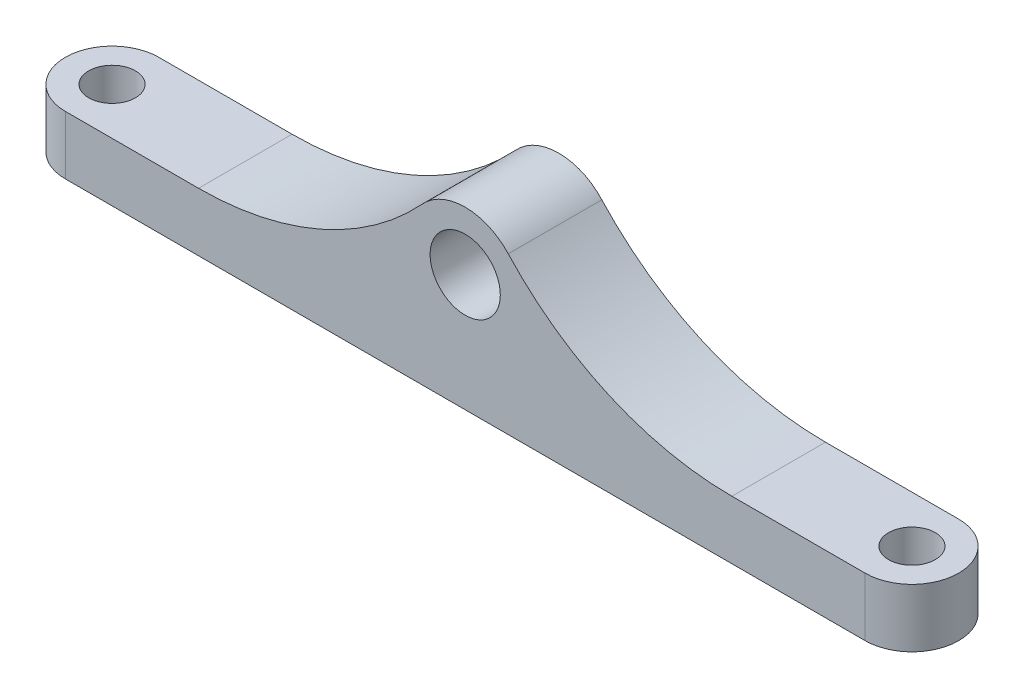
ISO-10303-21;
HEADER;
FILE_DESCRIPTION(('STEP AP214'),'2;1');
FILE_NAME('part.step','',(''),(''),'','','');
FILE_SCHEMA(('AUTOMOTIVE_DESIGN { 1 0 10303 214 1 1 1 1 }'));
ENDSEC;
DATA;
#1=APPLICATION_CONTEXT('core data for automotive mechanical design processes');
#2=APPLICATION_PROTOCOL_DEFINITION('international standard','automotive_design',2000,#1);
#3=PRODUCT_CONTEXT('',#1,'mechanical');
#4=PRODUCT('Part','Part','',(#3));
#5=PRODUCT_RELATED_PRODUCT_CATEGORY('part','',(#4));
#6=PRODUCT_DEFINITION_FORMATION('','',#4);
#7=PRODUCT_DEFINITION_CONTEXT('part definition',#1,'design');
#8=PRODUCT_DEFINITION('design','',#6,#7);
#9=PRODUCT_DEFINITION_SHAPE('','',#8);
#10=(LENGTH_UNIT() NAMED_UNIT(*) SI_UNIT(.MILLI.,.METRE.));
#11=(NAMED_UNIT(*) PLANE_ANGLE_UNIT() SI_UNIT($,.RADIAN.));
#12=(NAMED_UNIT(*) SI_UNIT($,.STERADIAN.) SOLID_ANGLE_UNIT());
#13=UNCERTAINTY_MEASURE_WITH_UNIT(LENGTH_MEASURE(1.E-05),#10,'distance_accuracy_value','');
#14=(GEOMETRIC_REPRESENTATION_CONTEXT(3) GLOBAL_UNCERTAINTY_ASSIGNED_CONTEXT((#13)) GLOBAL_UNIT_ASSIGNED_CONTEXT((#10,
#11,#12)) REPRESENTATION_CONTEXT('',''));
#15=CARTESIAN_POINT('',(0.,0.,0.));
#16=DIRECTION('',(0.,0.,1.));
#17=DIRECTION('',(1.,0.,0.));
#18=AXIS2_PLACEMENT_3D('',#15,#16,#17);
#19=CARTESIAN_POINT('',(0.,5.,0.));
#20=DIRECTION('',(0.,1.,0.));
#21=DIRECTION('',(0.,0.,1.));
#22=AXIS2_PLACEMENT_3D('',#19,#20,#21);
#23=PLANE('',#22);
#24=DIRECTION('',(0.,0.,1.));
#25=VECTOR('',#24,1.);
#26=CARTESIAN_POINT('',(-22.7988989435407,5.,-50.6814649743463));
#27=LINE('',#26,#25);
#28=CARTESIAN_POINT('',(-22.7988989435407,5.,-4.));
#29=VERTEX_POINT('',#28);
#30=CARTESIAN_POINT('',(-22.7988989435407,5.,4.));
#31=VERTEX_POINT('',#30);
#32=EDGE_CURVE('E154',#29,#31,#27,.T.);
#33=ORIENTED_EDGE('',*,*,#32,.F.);
#34=DIRECTION('',(1.,0.,0.));
#35=VECTOR('',#34,1.);
#36=CARTESIAN_POINT('',(0.,5.,-4.));
#37=LINE('',#36,#35);
#38=CARTESIAN_POINT('',(-34.19,5.,-4.));
#39=VERTEX_POINT('',#38);
#40=EDGE_CURVE('E138',#39,#29,#37,.T.);
#41=ORIENTED_EDGE('',*,*,#40,.F.);
#42=CARTESIAN_POINT('',(-34.19,5.,0.));
#43=DIRECTION('',(0.,1.,0.));
#44=DIRECTION('',(0.,0.,1.));
#45=AXIS2_PLACEMENT_3D('',#42,#43,#44);
#46=CIRCLE('',#45,4.);
#47=CARTESIAN_POINT('',(-34.19,5.,4.));
#48=VERTEX_POINT('',#47);
#49=EDGE_CURVE('E65',#39,#48,#46,.T.);
#50=ORIENTED_EDGE('',*,*,#49,.T.);
#51=DIRECTION('',(1.,0.,0.));
#52=VECTOR('',#51,1.);
#53=CARTESIAN_POINT('',(0.,5.,4.));
#54=LINE('',#53,#52);
#55=EDGE_CURVE('E156',#48,#31,#54,.T.);
#56=ORIENTED_EDGE('',*,*,#55,.T.);
#57=EDGE_LOOP('',(#33,#41,#50,#56));
#58=FACE_BOUND('',#57,.T.);
#59=CARTESIAN_POINT('',(-34.19,5.,0.));
#60=DIRECTION('',(0.,1.,0.));
#61=DIRECTION('',(0.,0.,1.));
#62=AXIS2_PLACEMENT_3D('',#59,#60,#61);
#63=CIRCLE('',#62,2.);
#64=CARTESIAN_POINT('',(-34.19,5.,2.));
#65=VERTEX_POINT('',#64);
#66=EDGE_CURVE('E163',#65,#65,#63,.T.);
#67=ORIENTED_EDGE('',*,*,#66,.F.);
#68=EDGE_LOOP('',(#67));
#69=FACE_BOUND('',#68,.T.);
#70=ADVANCED_FACE('F41',(#58,#69),#23,.T.);
#71=CARTESIAN_POINT('',(0.,5.,4.));
#72=DIRECTION('',(0.,0.,-1.));
#73=DIRECTION('',(-1.,0.,0.));
#74=AXIS2_PLACEMENT_3D('',#71,#72,#73);
#75=PLANE('',#74);
#76=DIRECTION('',(1.,0.,0.));
#77=VECTOR('',#76,1.);
#78=CARTESIAN_POINT('',(0.,0.,4.));
#79=LINE('',#78,#77);
#80=CARTESIAN_POINT('',(-34.19,0.,4.));
#81=VERTEX_POINT('',#80);
#82=CARTESIAN_POINT('',(34.19,0.,4.));
#83=VERTEX_POINT('',#82);
#84=EDGE_CURVE('E139',#81,#83,#79,.T.);
#85=ORIENTED_EDGE('',*,*,#84,.T.);
#86=DIRECTION('',(0.,-1.,0.));
#87=VECTOR('',#86,1.);
#88=CARTESIAN_POINT('',(34.19,5.,4.));
#89=LINE('',#88,#87);
#90=CARTESIAN_POINT('',(34.19,5.,4.));
#91=VERTEX_POINT('',#90);
#92=EDGE_CURVE('E11',#91,#83,#89,.T.);
#93=ORIENTED_EDGE('',*,*,#92,.F.);
#94=CARTESIAN_POINT('',(22.7988989435407,5.,4.));
#95=VERTEX_POINT('',#94);
#96=EDGE_CURVE('E94',#95,#91,#54,.T.);
#97=ORIENTED_EDGE('',*,*,#96,.F.);
#98=CARTESIAN_POINT('',(22.7988989435407,30.989489651889,4.));
#99=DIRECTION('',(0.,0.,1.));
#100=DIRECTION('',(1.,0.,0.));
#101=AXIS2_PLACEMENT_3D('',#98,#99,#100);
#102=CIRCLE('',#101,25.989489651889);
#103=CARTESIAN_POINT('',(3.67848893280354,13.3865497443921,4.));
#104=VERTEX_POINT('',#103);
#105=EDGE_CURVE('E201',#95,#104,#102,.F.);
#106=ORIENTED_EDGE('',*,*,#105,.T.);
#107=CARTESIAN_POINT('',(0.,10.,4.));
#108=DIRECTION('',(0.,0.,1.));
#109=DIRECTION('',(1.,0.,0.));
#110=AXIS2_PLACEMENT_3D('',#107,#108,#109);
#111=CIRCLE('',#110,5.);
#112=CARTESIAN_POINT('',(-3.67848893280353,13.3865497443921,4.));
#113=VERTEX_POINT('',#112);
#114=EDGE_CURVE('E146',#104,#113,#111,.T.);
#115=ORIENTED_EDGE('',*,*,#114,.T.);
#116=CARTESIAN_POINT('',(-22.7988989435407,30.989489651889,4.));
#117=DIRECTION('',(0.,0.,1.));
#118=DIRECTION('',(1.,0.,0.));
#119=AXIS2_PLACEMENT_3D('',#116,#117,#118);
#120=CIRCLE('',#119,25.989489651889);
#121=EDGE_CURVE('E125',#31,#113,#120,.T.);
#122=ORIENTED_EDGE('',*,*,#121,.F.);
#123=ORIENTED_EDGE('',*,*,#55,.F.);
#124=DIRECTION('',(0.,-1.,0.));
#125=VECTOR('',#124,1.);
#126=CARTESIAN_POINT('',(-34.19,5.,4.));
#127=LINE('',#126,#125);
#128=EDGE_CURVE('E168',#48,#81,#127,.T.);
#129=ORIENTED_EDGE('',*,*,#128,.T.);
#130=EDGE_LOOP('',(#85,#93,#97,#106,#115,#122,#123,#129));
#131=FACE_BOUND('',#130,.T.);
#132=CARTESIAN_POINT('',(0.,10.,4.));
#133=DIRECTION('',(0.,0.,1.));
#134=DIRECTION('',(1.,0.,0.));
#135=AXIS2_PLACEMENT_3D('',#132,#133,#134);
#136=CIRCLE('',#135,3.);
#137=CARTESIAN_POINT('',(3.,10.,4.));
#138=VERTEX_POINT('',#137);
#139=EDGE_CURVE('E153',#138,#138,#136,.T.);
#140=ORIENTED_EDGE('',*,*,#139,.F.);
#141=EDGE_LOOP('',(#140));
#142=FACE_BOUND('',#141,.T.);
#143=ADVANCED_FACE('F43',(#131,#142),#75,.F.);
#144=CARTESIAN_POINT('',(34.19,5.,0.));
#145=DIRECTION('',(0.,-1.,0.));
#146=DIRECTION('',(0.,0.,-1.));
#147=AXIS2_PLACEMENT_3D('',#144,#145,#146);
#148=CYLINDRICAL_SURFACE('',#147,4.00000000000001);
#149=CARTESIAN_POINT('',(34.19,0.,0.));
#150=DIRECTION('',(0.,1.,0.));
#151=DIRECTION('',(0.,0.,1.));
#152=AXIS2_PLACEMENT_3D('',#149,#150,#151);
#153=CIRCLE('',#152,4.00000000000001);
#154=CARTESIAN_POINT('',(34.19,0.,-4.));
#155=VERTEX_POINT('',#154);
#156=EDGE_CURVE('E143',#83,#155,#153,.T.);
#157=ORIENTED_EDGE('',*,*,#156,.T.);
#158=DIRECTION('',(0.,-1.,0.));
#159=VECTOR('',#158,1.);
#160=CARTESIAN_POINT('',(34.19,5.,-4.));
#161=LINE('',#160,#159);
#162=CARTESIAN_POINT('',(34.19,5.,-4.));
#163=VERTEX_POINT('',#162);
#164=EDGE_CURVE('E49',#163,#155,#161,.T.);
#165=ORIENTED_EDGE('',*,*,#164,.F.);
#166=CARTESIAN_POINT('',(34.19,5.,0.));
#167=DIRECTION('',(0.,1.,0.));
#168=DIRECTION('',(0.,0.,1.));
#169=AXIS2_PLACEMENT_3D('',#166,#167,#168);
#170=CIRCLE('',#169,4.00000000000001);
#171=EDGE_CURVE('E158',#91,#163,#170,.T.);
#172=ORIENTED_EDGE('',*,*,#171,.F.);
#173=ORIENTED_EDGE('',*,*,#92,.T.);
#174=EDGE_LOOP('',(#157,#165,#172,#173));
#175=FACE_BOUND('',#174,.T.);
#176=ADVANCED_FACE('F187',(#175),#148,.T.);
#177=CARTESIAN_POINT('',(0.,5.,-4.));
#178=DIRECTION('',(0.,0.,-1.));
#179=DIRECTION('',(-1.,0.,0.));
#180=AXIS2_PLACEMENT_3D('',#177,#178,#179);
#181=PLANE('',#180);
#182=DIRECTION('',(1.,0.,0.));
#183=VECTOR('',#182,1.);
#184=CARTESIAN_POINT('',(0.,0.,-4.));
#185=LINE('',#184,#183);
#186=CARTESIAN_POINT('',(-34.19,0.,-4.));
#187=VERTEX_POINT('',#186);
#188=EDGE_CURVE('E172',#187,#155,#185,.T.);
#189=ORIENTED_EDGE('',*,*,#188,.F.);
#190=DIRECTION('',(0.,-1.,0.));
#191=VECTOR('',#190,1.);
#192=CARTESIAN_POINT('',(-34.19,5.,-4.));
#193=LINE('',#192,#191);
#194=EDGE_CURVE('E183',#39,#187,#193,.T.);
#195=ORIENTED_EDGE('',*,*,#194,.F.);
#196=ORIENTED_EDGE('',*,*,#40,.T.);
#197=CARTESIAN_POINT('',(-22.7988989435407,30.989489651889,-4.));
#198=DIRECTION('',(0.,0.,-1.));
#199=DIRECTION('',(-1.,0.,0.));
#200=AXIS2_PLACEMENT_3D('',#197,#198,#199);
#201=CIRCLE('',#200,25.989489651889);
#202=CARTESIAN_POINT('',(-3.67848893280353,13.3865497443921,-4.));
#203=VERTEX_POINT('',#202);
#204=EDGE_CURVE('E129',#29,#203,#201,.F.);
#205=ORIENTED_EDGE('',*,*,#204,.T.);
#206=CARTESIAN_POINT('',(0.,10.,-4.));
#207=DIRECTION('',(0.,0.,-1.));
#208=DIRECTION('',(-1.,0.,0.));
#209=AXIS2_PLACEMENT_3D('',#206,#207,#208);
#210=CIRCLE('',#209,5.);
#211=CARTESIAN_POINT('',(3.67848893280354,13.3865497443921,-4.));
#212=VERTEX_POINT('',#211);
#213=EDGE_CURVE('E117',#212,#203,#210,.F.);
#214=ORIENTED_EDGE('',*,*,#213,.F.);
#215=CARTESIAN_POINT('',(22.7988989435407,30.989489651889,-4.));
#216=DIRECTION('',(0.,0.,-1.));
#217=DIRECTION('',(-1.,0.,0.));
#218=AXIS2_PLACEMENT_3D('',#215,#216,#217);
#219=CIRCLE('',#218,25.989489651889);
#220=CARTESIAN_POINT('',(22.7988989435407,5.,-4.));
#221=VERTEX_POINT('',#220);
#222=EDGE_CURVE('E56',#221,#212,#219,.T.);
#223=ORIENTED_EDGE('',*,*,#222,.F.);
#224=EDGE_CURVE('E160',#221,#163,#37,.T.);
#225=ORIENTED_EDGE('',*,*,#224,.T.);
#226=ORIENTED_EDGE('',*,*,#164,.T.);
#227=EDGE_LOOP('',(#189,#195,#196,#205,#214,#223,#225,#226));
#228=FACE_BOUND('',#227,.T.);
#229=CARTESIAN_POINT('',(0.,10.,-4.));
#230=DIRECTION('',(0.,0.,-1.));
#231=DIRECTION('',(-1.,0.,0.));
#232=AXIS2_PLACEMENT_3D('',#229,#230,#231);
#233=CIRCLE('',#232,3.);
#234=CARTESIAN_POINT('',(-3.,10.,-4.));
#235=VERTEX_POINT('',#234);
#236=EDGE_CURVE('E140',#235,#235,#233,.F.);
#237=ORIENTED_EDGE('',*,*,#236,.T.);
#238=EDGE_LOOP('',(#237));
#239=FACE_BOUND('',#238,.T.);
#240=ADVANCED_FACE('F136',(#228,#239),#181,.T.);
#241=CARTESIAN_POINT('',(-34.19,5.,0.));
#242=DIRECTION('',(0.,-1.,0.));
#243=DIRECTION('',(0.,0.,-1.));
#244=AXIS2_PLACEMENT_3D('',#241,#242,#243);
#245=CYLINDRICAL_SURFACE('',#244,2.);
#246=ORIENTED_EDGE('',*,*,#66,.T.);
#247=EDGE_LOOP('',(#246));
#248=FACE_BOUND('',#247,.T.);
#249=CARTESIAN_POINT('',(-34.19,0.,0.));
#250=DIRECTION('',(0.,1.,0.));
#251=DIRECTION('',(0.,0.,1.));
#252=AXIS2_PLACEMENT_3D('',#249,#250,#251);
#253=CIRCLE('',#252,2.);
#254=CARTESIAN_POINT('',(-34.19,0.,2.));
#255=VERTEX_POINT('',#254);
#256=EDGE_CURVE('E176',#255,#255,#253,.T.);
#257=ORIENTED_EDGE('',*,*,#256,.F.);
#258=EDGE_LOOP('',(#257));
#259=FACE_BOUND('',#258,.T.);
#260=ADVANCED_FACE('F288',(#248,#259),#245,.F.);
#261=CARTESIAN_POINT('',(-34.19,5.,0.));
#262=DIRECTION('',(0.,-1.,0.));
#263=DIRECTION('',(0.,0.,-1.));
#264=AXIS2_PLACEMENT_3D('',#261,#262,#263);
#265=CYLINDRICAL_SURFACE('',#264,4.);
#266=CARTESIAN_POINT('',(-34.19,0.,0.));
#267=DIRECTION('',(0.,1.,0.));
#268=DIRECTION('',(0.,0.,1.));
#269=AXIS2_PLACEMENT_3D('',#266,#267,#268);
#270=CIRCLE('',#269,4.);
#271=EDGE_CURVE('E86',#187,#81,#270,.T.);
#272=ORIENTED_EDGE('',*,*,#271,.T.);
#273=ORIENTED_EDGE('',*,*,#128,.F.);
#274=ORIENTED_EDGE('',*,*,#49,.F.);
#275=ORIENTED_EDGE('',*,*,#194,.T.);
#276=EDGE_LOOP('',(#272,#273,#274,#275));
#277=FACE_BOUND('',#276,.T.);
#278=ADVANCED_FACE('F196',(#277),#265,.T.);
#279=CARTESIAN_POINT('',(34.19,5.,0.));
#280=DIRECTION('',(0.,-1.,0.));
#281=DIRECTION('',(0.,0.,-1.));
#282=AXIS2_PLACEMENT_3D('',#279,#280,#281);
#283=CYLINDRICAL_SURFACE('',#282,2.);
#284=CARTESIAN_POINT('',(34.19,5.,0.));
#285=DIRECTION('',(0.,1.,0.));
#286=DIRECTION('',(0.,0.,1.));
#287=AXIS2_PLACEMENT_3D('',#284,#285,#286);
#288=CIRCLE('',#287,2.);
#289=CARTESIAN_POINT('',(34.19,5.,2.));
#290=VERTEX_POINT('',#289);
#291=EDGE_CURVE('E166',#290,#290,#288,.T.);
#292=ORIENTED_EDGE('',*,*,#291,.T.);
#293=EDGE_LOOP('',(#292));
#294=FACE_BOUND('',#293,.T.);
#295=CARTESIAN_POINT('',(34.19,0.,0.));
#296=DIRECTION('',(0.,1.,0.));
#297=DIRECTION('',(0.,0.,1.));
#298=AXIS2_PLACEMENT_3D('',#295,#296,#297);
#299=CIRCLE('',#298,2.);
#300=CARTESIAN_POINT('',(34.19,0.,2.));
#301=VERTEX_POINT('',#300);
#302=EDGE_CURVE('E179',#301,#301,#299,.T.);
#303=ORIENTED_EDGE('',*,*,#302,.F.);
#304=EDGE_LOOP('',(#303));
#305=FACE_BOUND('',#304,.T.);
#306=ADVANCED_FACE('F208',(#294,#305),#283,.F.);
#307=DIRECTION('',(0.,0.,1.));
#308=VECTOR('',#307,1.);
#309=CARTESIAN_POINT('',(22.7988989435407,5.,-50.6814649743463));
#310=LINE('',#309,#308);
#311=EDGE_CURVE('E151',#221,#95,#310,.T.);
#312=ORIENTED_EDGE('',*,*,#311,.T.);
#313=ORIENTED_EDGE('',*,*,#96,.T.);
#314=ORIENTED_EDGE('',*,*,#171,.T.);
#315=ORIENTED_EDGE('',*,*,#224,.F.);
#316=EDGE_LOOP('',(#312,#313,#314,#315));
#317=FACE_BOUND('',#316,.T.);
#318=ORIENTED_EDGE('',*,*,#291,.F.);
#319=EDGE_LOOP('',(#318));
#320=FACE_BOUND('',#319,.T.);
#321=ADVANCED_FACE('F205',(#317,#320),#23,.T.);
#322=CARTESIAN_POINT('',(0.,0.,0.));
#323=DIRECTION('',(0.,1.,0.));
#324=DIRECTION('',(0.,0.,1.));
#325=AXIS2_PLACEMENT_3D('',#322,#323,#324);
#326=PLANE('',#325);
#327=ORIENTED_EDGE('',*,*,#84,.F.);
#328=ORIENTED_EDGE('',*,*,#271,.F.);
#329=ORIENTED_EDGE('',*,*,#188,.T.);
#330=ORIENTED_EDGE('',*,*,#156,.F.);
#331=EDGE_LOOP('',(#327,#328,#329,#330));
#332=FACE_BOUND('',#331,.T.);
#333=ORIENTED_EDGE('',*,*,#256,.T.);
#334=EDGE_LOOP('',(#333));
#335=FACE_BOUND('',#334,.T.);
#336=ORIENTED_EDGE('',*,*,#302,.T.);
#337=EDGE_LOOP('',(#336));
#338=FACE_BOUND('',#337,.T.);
#339=ADVANCED_FACE('F191',(#332,#335,#338),#326,.F.);
#340=CARTESIAN_POINT('',(-22.7988989435407,30.989489651889,-50.6814649743463));
#341=DIRECTION('',(0.,0.,1.));
#342=DIRECTION('',(1.,0.,0.));
#343=AXIS2_PLACEMENT_3D('',#340,#341,#342);
#344=CYLINDRICAL_SURFACE('',#343,25.989489651889);
#345=ORIENTED_EDGE('',*,*,#204,.F.);
#346=ORIENTED_EDGE('',*,*,#32,.T.);
#347=ORIENTED_EDGE('',*,*,#121,.T.);
#348=DIRECTION('',(0.,0.,1.));
#349=VECTOR('',#348,1.);
#350=CARTESIAN_POINT('',(-3.67848893280353,13.3865497443921,-50.6814649743463));
#351=LINE('',#350,#349);
#352=EDGE_CURVE('E121',#203,#113,#351,.T.);
#353=ORIENTED_EDGE('',*,*,#352,.F.);
#354=EDGE_LOOP('',(#345,#346,#347,#353));
#355=FACE_BOUND('',#354,.T.);
#356=ADVANCED_FACE('F128',(#355),#344,.F.);
#357=CARTESIAN_POINT('',(0.,10.,-50.6814649743463));
#358=DIRECTION('',(0.,0.,1.));
#359=DIRECTION('',(1.,0.,0.));
#360=AXIS2_PLACEMENT_3D('',#357,#358,#359);
#361=CYLINDRICAL_SURFACE('',#360,5.);
#362=DIRECTION('',(0.,0.,1.));
#363=VECTOR('',#362,1.);
#364=CARTESIAN_POINT('',(3.67848893280354,13.3865497443921,-50.6814649743463));
#365=LINE('',#364,#363);
#366=EDGE_CURVE('E123',#212,#104,#365,.T.);
#367=ORIENTED_EDGE('',*,*,#366,.F.);
#368=ORIENTED_EDGE('',*,*,#213,.T.);
#369=ORIENTED_EDGE('',*,*,#352,.T.);
#370=ORIENTED_EDGE('',*,*,#114,.F.);
#371=EDGE_LOOP('',(#367,#368,#369,#370));
#372=FACE_BOUND('',#371,.T.);
#373=ADVANCED_FACE('F119',(#372),#361,.T.);
#374=CARTESIAN_POINT('',(22.7988989435407,30.989489651889,-50.6814649743463));
#375=DIRECTION('',(0.,0.,1.));
#376=DIRECTION('',(1.,0.,0.));
#377=AXIS2_PLACEMENT_3D('',#374,#375,#376);
#378=CYLINDRICAL_SURFACE('',#377,25.989489651889);
#379=ORIENTED_EDGE('',*,*,#311,.F.);
#380=ORIENTED_EDGE('',*,*,#222,.T.);
#381=ORIENTED_EDGE('',*,*,#366,.T.);
#382=ORIENTED_EDGE('',*,*,#105,.F.);
#383=EDGE_LOOP('',(#379,#380,#381,#382));
#384=FACE_BOUND('',#383,.T.);
#385=ADVANCED_FACE('F204',(#384),#378,.F.);
#386=CARTESIAN_POINT('',(0.,10.,-50.6814649743463));
#387=DIRECTION('',(0.,0.,1.));
#388=DIRECTION('',(1.,0.,0.));
#389=AXIS2_PLACEMENT_3D('',#386,#387,#388);
#390=CYLINDRICAL_SURFACE('',#389,3.);
#391=ORIENTED_EDGE('',*,*,#139,.T.);
#392=EDGE_LOOP('',(#391));
#393=FACE_BOUND('',#392,.T.);
#394=ORIENTED_EDGE('',*,*,#236,.F.);
#395=EDGE_LOOP('',(#394));
#396=FACE_BOUND('',#395,.T.);
#397=ADVANCED_FACE('F228',(#393,#396),#390,.F.);
#398=CLOSED_SHELL('',(#70,#143,#176,#240,#260,#278,#306,#321,#339,#356,#373,#385,#397));
#399=MANIFOLD_SOLID_BREP('B2',#398);
#400=ADVANCED_BREP_SHAPE_REPRESENTATION('',(#18,#399),#14);
#401=SHAPE_DEFINITION_REPRESENTATION(#9,#400);
ENDSEC;
END-ISO-10303-21;
